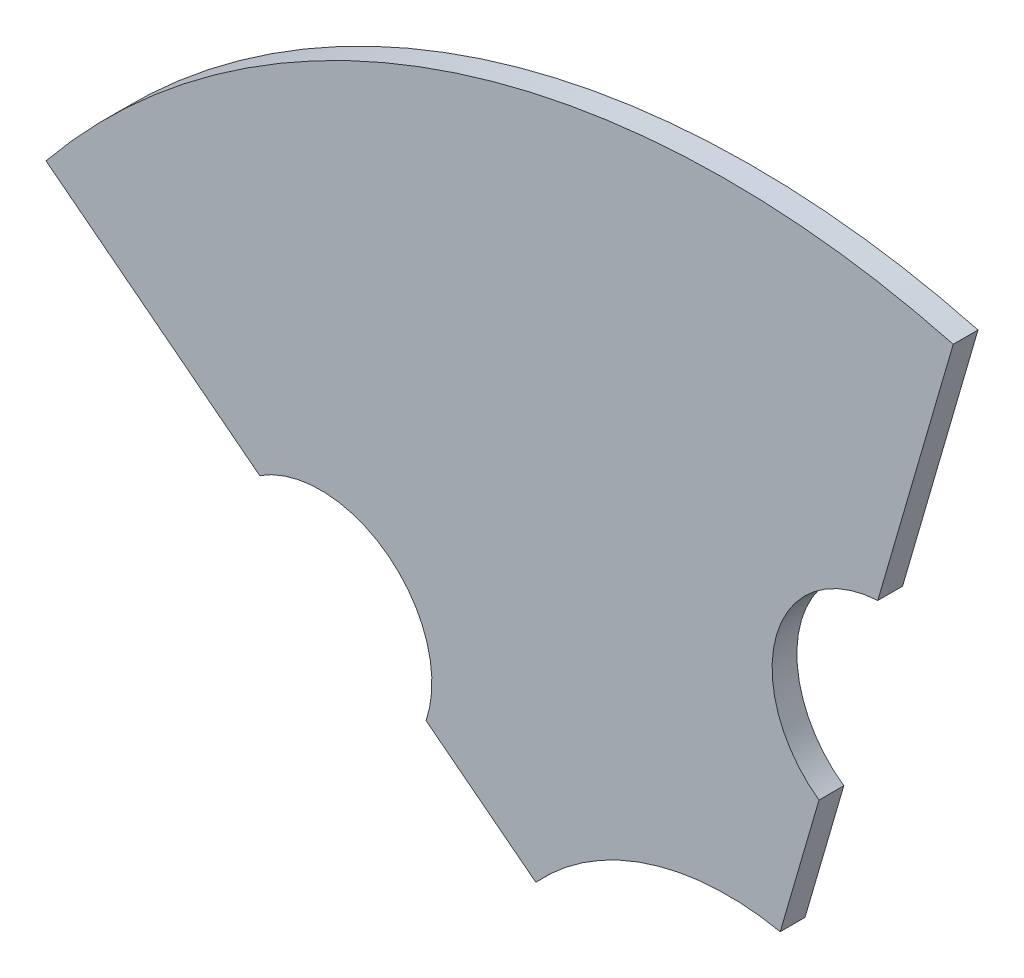
ISO-10303-21;
HEADER;
FILE_DESCRIPTION(('STEP AP214'),'2;1');
FILE_NAME('part.step','',(''),(''),'','','');
FILE_SCHEMA(('AUTOMOTIVE_DESIGN { 1 0 10303 214 1 1 1 1 }'));
ENDSEC;
DATA;
#1=APPLICATION_CONTEXT('core data for automotive mechanical design processes');
#2=APPLICATION_PROTOCOL_DEFINITION('international standard','automotive_design',2000,#1);
#3=PRODUCT_CONTEXT('',#1,'mechanical');
#4=PRODUCT('Part','Part','',(#3));
#5=PRODUCT_RELATED_PRODUCT_CATEGORY('part','',(#4));
#6=PRODUCT_DEFINITION_FORMATION('','',#4);
#7=PRODUCT_DEFINITION_CONTEXT('part definition',#1,'design');
#8=PRODUCT_DEFINITION('design','',#6,#7);
#9=PRODUCT_DEFINITION_SHAPE('','',#8);
#10=(LENGTH_UNIT() NAMED_UNIT(*) SI_UNIT(.MILLI.,.METRE.));
#11=(NAMED_UNIT(*) PLANE_ANGLE_UNIT() SI_UNIT($,.RADIAN.));
#12=(NAMED_UNIT(*) SI_UNIT($,.STERADIAN.) SOLID_ANGLE_UNIT());
#13=UNCERTAINTY_MEASURE_WITH_UNIT(LENGTH_MEASURE(1.E-05),#10,'distance_accuracy_value','');
#14=(GEOMETRIC_REPRESENTATION_CONTEXT(3) GLOBAL_UNCERTAINTY_ASSIGNED_CONTEXT((#13)) GLOBAL_UNIT_ASSIGNED_CONTEXT((#10,
#11,#12)) REPRESENTATION_CONTEXT('',''));
#15=CARTESIAN_POINT('',(0.,0.,0.));
#16=DIRECTION('',(0.,0.,1.));
#17=DIRECTION('',(1.,0.,0.));
#18=AXIS2_PLACEMENT_3D('',#15,#16,#17);
#19=CARTESIAN_POINT('',(-1.02733869968574,0.298572552493891,-1.27));
#20=DIRECTION('',(-0.960267870711613,0.279079946393476,0.));
#21=DIRECTION('',(-0.279079946393476,-0.960267870711613,0.));
#22=AXIS2_PLACEMENT_3D('',#19,#20,#21);
#23=PLANE('',#22);
#24=DIRECTION('',(-0.279079946393476,-0.960267870711613,0.));
#25=VECTOR('',#24,1.);
#26=CARTESIAN_POINT('',(-1.02733869968574,0.298572552493891,-1.27));
#27=LINE('',#26,#25);
#28=CARTESIAN_POINT('',(4.66964003784766,19.900932781084,-1.27));
#29=VERTEX_POINT('',#28);
#30=CARTESIAN_POINT('',(2.68219604859296,13.0624672002234,-1.27));
#31=VERTEX_POINT('',#30);
#32=EDGE_CURVE('E121',#29,#31,#27,.T.);
#33=ORIENTED_EDGE('',*,*,#32,.F.);
#34=DIRECTION('',(0.,0.,1.));
#35=VECTOR('',#34,1.);
#36=CARTESIAN_POINT('',(4.66964003784766,19.900932781084,-1.27));
#37=LINE('',#36,#35);
#38=CARTESIAN_POINT('',(4.66964003784766,19.900932781084,0.));
#39=VERTEX_POINT('',#38);
#40=EDGE_CURVE('E107',#29,#39,#37,.T.);
#41=ORIENTED_EDGE('',*,*,#40,.T.);
#42=DIRECTION('',(-0.279079946393476,-0.960267870711613,0.));
#43=VECTOR('',#42,1.);
#44=CARTESIAN_POINT('',(-1.02733869968574,0.298572552493891,0.));
#45=LINE('',#44,#43);
#46=CARTESIAN_POINT('',(2.68219604859296,13.0624672002234,0.));
#47=VERTEX_POINT('',#46);
#48=EDGE_CURVE('E158',#39,#47,#45,.T.);
#49=ORIENTED_EDGE('',*,*,#48,.T.);
#50=DIRECTION('',(0.,0.,1.));
#51=VECTOR('',#50,1.);
#52=CARTESIAN_POINT('',(2.68219604859296,13.0624672002234,-1.27));
#53=LINE('',#52,#51);
#54=EDGE_CURVE('E11',#31,#47,#53,.T.);
#55=ORIENTED_EDGE('',*,*,#54,.F.);
#56=EDGE_LOOP('',(#33,#41,#49,#55));
#57=FACE_BOUND('',#56,.T.);
#58=ADVANCED_FACE('F41',(#57),#23,.F.);
#59=CARTESIAN_POINT('',(0.655637923929589,0.845404805806061,-1.27));
#60=DIRECTION('',(-0.61283394985728,-0.790211712076153,0.));
#61=DIRECTION('',(0.790211712076153,-0.61283394985728,0.));
#62=AXIS2_PLACEMENT_3D('',#59,#60,#61);
#63=PLANE('',#62);
#64=DIRECTION('',(0.,0.,1.));
#65=VECTOR('',#64,1.);
#66=CARTESIAN_POINT('',(-15.4752929438175,13.3554472760491,-1.27));
#67=LINE('',#66,#65);
#68=CARTESIAN_POINT('',(-15.4752929438175,13.3554472760491,-1.27));
#69=VERTEX_POINT('',#68);
#70=CARTESIAN_POINT('',(-15.4752929438175,13.3554472760491,0.));
#71=VERTEX_POINT('',#70);
#72=EDGE_CURVE('E59',#69,#71,#67,.T.);
#73=ORIENTED_EDGE('',*,*,#72,.F.);
#74=DIRECTION('',(0.790211712076153,-0.61283394985728,0.));
#75=VECTOR('',#74,1.);
#76=CARTESIAN_POINT('',(0.655637923929589,0.845404805806061,-1.27));
#77=LINE('',#76,#75);
#78=CARTESIAN_POINT('',(-9.84786776440252,8.99120267232597,-1.27));
#79=VERTEX_POINT('',#78);
#80=EDGE_CURVE('E145',#69,#79,#77,.T.);
#81=ORIENTED_EDGE('',*,*,#80,.T.);
#82=DIRECTION('',(0.,0.,1.));
#83=VECTOR('',#82,1.);
#84=CARTESIAN_POINT('',(-9.84786776440252,8.99120267232597,-1.27));
#85=LINE('',#84,#83);
#86=CARTESIAN_POINT('',(-9.84786776440252,8.99120267232597,0.));
#87=VERTEX_POINT('',#86);
#88=EDGE_CURVE('E51',#79,#87,#85,.T.);
#89=ORIENTED_EDGE('',*,*,#88,.T.);
#90=DIRECTION('',(0.790211712076153,-0.61283394985728,0.));
#91=VECTOR('',#90,1.);
#92=CARTESIAN_POINT('',(0.655637923929589,0.845404805806061,0.));
#93=LINE('',#92,#91);
#94=EDGE_CURVE('E162',#71,#87,#93,.T.);
#95=ORIENTED_EDGE('',*,*,#94,.F.);
#96=EDGE_LOOP('',(#73,#81,#89,#95));
#97=FACE_BOUND('',#96,.T.);
#98=ADVANCED_FACE('F189',(#97),#63,.T.);
#99=CARTESIAN_POINT('',(11.5514376911436,43.5800586537883,0.));
#100=VERTEX_POINT('',#99);
#101=CARTESIAN_POINT('',(7.68226165110816,30.2668647629782,0.));
#102=VERTEX_POINT('',#101);
#103=EDGE_CURVE('E153',#100,#102,#45,.T.);
#104=ORIENTED_EDGE('',*,*,#103,.T.);
#105=DIRECTION('',(0.,0.,1.));
#106=VECTOR('',#105,1.);
#107=CARTESIAN_POINT('',(7.68226165110816,30.2668647629782,-1.27));
#108=LINE('',#107,#106);
#109=CARTESIAN_POINT('',(7.68226165110816,30.2668647629782,-1.27));
#110=VERTEX_POINT('',#109);
#111=EDGE_CURVE('E67',#110,#102,#108,.T.);
#112=ORIENTED_EDGE('',*,*,#111,.F.);
#113=CARTESIAN_POINT('',(11.5514376911436,43.5800586537883,-1.27));
#114=VERTEX_POINT('',#113);
#115=EDGE_CURVE('E125',#114,#110,#27,.T.);
#116=ORIENTED_EDGE('',*,*,#115,.F.);
#117=DIRECTION('',(0.,0.,1.));
#118=VECTOR('',#117,1.);
#119=CARTESIAN_POINT('',(11.5514376911436,43.5800586537883,-1.27));
#120=LINE('',#119,#118);
#121=EDGE_CURVE('E45',#114,#100,#120,.T.);
#122=ORIENTED_EDGE('',*,*,#121,.T.);
#123=EDGE_LOOP('',(#104,#112,#116,#122));
#124=FACE_BOUND('',#123,.T.);
#125=ADVANCED_FACE('F43',(#124),#23,.F.);
#126=CARTESIAN_POINT('',(0.,0.,-1.27));
#127=DIRECTION('',(0.,0.,1.));
#128=DIRECTION('',(1.,0.,0.));
#129=AXIS2_PLACEMENT_3D('',#126,#127,#128);
#130=CYLINDRICAL_SURFACE('',#129,13.335);
#131=CARTESIAN_POINT('',(0.,0.,0.));
#132=DIRECTION('',(0.,0.,1.));
#133=DIRECTION('',(1.,0.,0.));
#134=AXIS2_PLACEMENT_3D('',#131,#132,#133);
#135=CIRCLE('',#134,13.335);
#136=EDGE_CURVE('E130',#47,#87,#135,.T.);
#137=ORIENTED_EDGE('',*,*,#136,.T.);
#138=ORIENTED_EDGE('',*,*,#88,.F.);
#139=CARTESIAN_POINT('',(0.,0.,-1.27));
#140=DIRECTION('',(0.,0.,1.));
#141=DIRECTION('',(1.,0.,0.));
#142=AXIS2_PLACEMENT_3D('',#139,#140,#141);
#143=CIRCLE('',#142,13.335);
#144=EDGE_CURVE('E150',#31,#79,#143,.T.);
#145=ORIENTED_EDGE('',*,*,#144,.F.);
#146=ORIENTED_EDGE('',*,*,#54,.T.);
#147=EDGE_LOOP('',(#137,#138,#145,#146));
#148=FACE_BOUND('',#147,.T.);
#149=ADVANCED_FACE('F186',(#148),#130,.F.);
#150=DIRECTION('',(0.,0.,1.));
#151=VECTOR('',#150,1.);
#152=CARTESIAN_POINT('',(-24.0054969717908,19.9708878569242,-1.27));
#153=LINE('',#152,#151);
#154=CARTESIAN_POINT('',(-24.0054969717908,19.9708878569242,-1.27));
#155=VERTEX_POINT('',#154);
#156=CARTESIAN_POINT('',(-24.0054969717908,19.9708878569242,0.));
#157=VERTEX_POINT('',#156);
#158=EDGE_CURVE('E140',#155,#157,#153,.T.);
#159=ORIENTED_EDGE('',*,*,#158,.T.);
#160=CARTESIAN_POINT('',(-34.9610251723362,28.467243349142,0.));
#161=VERTEX_POINT('',#160);
#162=EDGE_CURVE('E136',#161,#157,#93,.T.);
#163=ORIENTED_EDGE('',*,*,#162,.F.);
#164=DIRECTION('',(0.,0.,1.));
#165=VECTOR('',#164,1.);
#166=CARTESIAN_POINT('',(-34.9610251723362,28.467243349142,-1.27));
#167=LINE('',#166,#165);
#168=CARTESIAN_POINT('',(-34.9610251723362,28.467243349142,-1.27));
#169=VERTEX_POINT('',#168);
#170=EDGE_CURVE('E168',#169,#161,#167,.T.);
#171=ORIENTED_EDGE('',*,*,#170,.F.);
#172=EDGE_CURVE('E146',#169,#155,#77,.T.);
#173=ORIENTED_EDGE('',*,*,#172,.T.);
#174=EDGE_LOOP('',(#159,#163,#171,#173));
#175=FACE_BOUND('',#174,.T.);
#176=ADVANCED_FACE('F180',(#175),#63,.T.);
#177=CARTESIAN_POINT('',(0.,0.,-1.27));
#178=DIRECTION('',(0.,0.,1.));
#179=DIRECTION('',(1.,0.,0.));
#180=AXIS2_PLACEMENT_3D('',#177,#178,#179);
#181=CYLINDRICAL_SURFACE('',#180,45.085);
#182=CARTESIAN_POINT('',(0.,0.,0.));
#183=DIRECTION('',(0.,0.,1.));
#184=DIRECTION('',(1.,0.,0.));
#185=AXIS2_PLACEMENT_3D('',#182,#183,#184);
#186=CIRCLE('',#185,45.085);
#187=EDGE_CURVE('E157',#100,#161,#186,.T.);
#188=ORIENTED_EDGE('',*,*,#187,.F.);
#189=ORIENTED_EDGE('',*,*,#121,.F.);
#190=CARTESIAN_POINT('',(0.,0.,-1.27));
#191=DIRECTION('',(0.,0.,1.));
#192=DIRECTION('',(1.,0.,0.));
#193=AXIS2_PLACEMENT_3D('',#190,#191,#192);
#194=CIRCLE('',#193,45.085);
#195=EDGE_CURVE('E134',#114,#169,#194,.T.);
#196=ORIENTED_EDGE('',*,*,#195,.T.);
#197=ORIENTED_EDGE('',*,*,#170,.T.);
#198=EDGE_LOOP('',(#188,#189,#196,#197));
#199=FACE_BOUND('',#198,.T.);
#200=ADVANCED_FACE('F178',(#199),#181,.T.);
#201=CARTESIAN_POINT('',(0.,0.,-1.27));
#202=DIRECTION('',(0.,0.,1.));
#203=DIRECTION('',(1.,0.,0.));
#204=AXIS2_PLACEMENT_3D('',#201,#202,#203);
#205=PLANE('',#204);
#206=ORIENTED_EDGE('',*,*,#115,.T.);
#207=CARTESIAN_POINT('',(7.97990452808567,24.5596207943201,-1.27));
#208=DIRECTION('',(0.,0.,1.));
#209=DIRECTION('',(1.,0.,0.));
#210=AXIS2_PLACEMENT_3D('',#207,#208,#209);
#211=CIRCLE('',#210,5.715);
#212=EDGE_CURVE('E110',#110,#29,#211,.T.);
#213=ORIENTED_EDGE('',*,*,#212,.T.);
#214=ORIENTED_EDGE('',*,*,#32,.T.);
#215=ORIENTED_EDGE('',*,*,#144,.T.);
#216=ORIENTED_EDGE('',*,*,#80,.F.);
#217=CARTESIAN_POINT('',(-20.8916612815078,15.1786804016986,-1.27));
#218=DIRECTION('',(0.,0.,1.));
#219=DIRECTION('',(-1.,0.,0.));
#220=AXIS2_PLACEMENT_3D('',#217,#218,#219);
#221=CIRCLE('',#220,5.715);
#222=EDGE_CURVE('E267',#69,#155,#221,.T.);
#223=ORIENTED_EDGE('',*,*,#222,.T.);
#224=ORIENTED_EDGE('',*,*,#172,.F.);
#225=ORIENTED_EDGE('',*,*,#195,.F.);
#226=EDGE_LOOP('',(#206,#213,#214,#215,#216,#223,#224,#225));
#227=FACE_BOUND('',#226,.T.);
#228=ADVANCED_FACE('F119',(#227),#205,.F.);
#229=CARTESIAN_POINT('',(0.,0.,0.));
#230=DIRECTION('',(0.,0.,1.));
#231=DIRECTION('',(1.,0.,0.));
#232=AXIS2_PLACEMENT_3D('',#229,#230,#231);
#233=PLANE('',#232);
#234=CARTESIAN_POINT('',(7.97990452808567,24.5596207943201,0.));
#235=DIRECTION('',(0.,0.,1.));
#236=DIRECTION('',(1.,0.,0.));
#237=AXIS2_PLACEMENT_3D('',#234,#235,#236);
#238=CIRCLE('',#237,5.715);
#239=EDGE_CURVE('E111',#102,#39,#238,.T.);
#240=ORIENTED_EDGE('',*,*,#239,.F.);
#241=ORIENTED_EDGE('',*,*,#103,.F.);
#242=ORIENTED_EDGE('',*,*,#187,.T.);
#243=ORIENTED_EDGE('',*,*,#162,.T.);
#244=CARTESIAN_POINT('',(-20.8916612815078,15.1786804016986,0.));
#245=DIRECTION('',(0.,0.,1.));
#246=DIRECTION('',(-1.,0.,0.));
#247=AXIS2_PLACEMENT_3D('',#244,#245,#246);
#248=CIRCLE('',#247,5.715);
#249=EDGE_CURVE('E262',#71,#157,#248,.T.);
#250=ORIENTED_EDGE('',*,*,#249,.F.);
#251=ORIENTED_EDGE('',*,*,#94,.T.);
#252=ORIENTED_EDGE('',*,*,#136,.F.);
#253=ORIENTED_EDGE('',*,*,#48,.F.);
#254=EDGE_LOOP('',(#240,#241,#242,#243,#250,#251,#252,#253));
#255=FACE_BOUND('',#254,.T.);
#256=ADVANCED_FACE('F177',(#255),#233,.T.);
#257=CARTESIAN_POINT('',(-20.8916612815078,15.1786804016986,-1.27));
#258=DIRECTION('',(0.,0.,1.));
#259=DIRECTION('',(1.,0.,0.));
#260=AXIS2_PLACEMENT_3D('',#257,#258,#259);
#261=CYLINDRICAL_SURFACE('',#260,5.715);
#262=ORIENTED_EDGE('',*,*,#249,.T.);
#263=ORIENTED_EDGE('',*,*,#158,.F.);
#264=ORIENTED_EDGE('',*,*,#222,.F.);
#265=ORIENTED_EDGE('',*,*,#72,.T.);
#266=EDGE_LOOP('',(#262,#263,#264,#265));
#267=FACE_BOUND('',#266,.T.);
#268=ADVANCED_FACE('F205',(#267),#261,.F.);
#269=CARTESIAN_POINT('',(7.97990452808567,24.5596207943201,-1.27));
#270=DIRECTION('',(0.,0.,1.));
#271=DIRECTION('',(1.,0.,0.));
#272=AXIS2_PLACEMENT_3D('',#269,#270,#271);
#273=CYLINDRICAL_SURFACE('',#272,5.715);
#274=ORIENTED_EDGE('',*,*,#239,.T.);
#275=ORIENTED_EDGE('',*,*,#40,.F.);
#276=ORIENTED_EDGE('',*,*,#212,.F.);
#277=ORIENTED_EDGE('',*,*,#111,.T.);
#278=EDGE_LOOP('',(#274,#275,#276,#277));
#279=FACE_BOUND('',#278,.T.);
#280=ADVANCED_FACE('F109',(#279),#273,.F.);
#281=CLOSED_SHELL('',(#58,#98,#125,#149,#176,#200,#228,#256,#268,#280));
#282=MANIFOLD_SOLID_BREP('B2',#281);
#283=ADVANCED_BREP_SHAPE_REPRESENTATION('',(#18,#282),#14);
#284=SHAPE_DEFINITION_REPRESENTATION(#9,#283);
ENDSEC;
END-ISO-10303-21;
